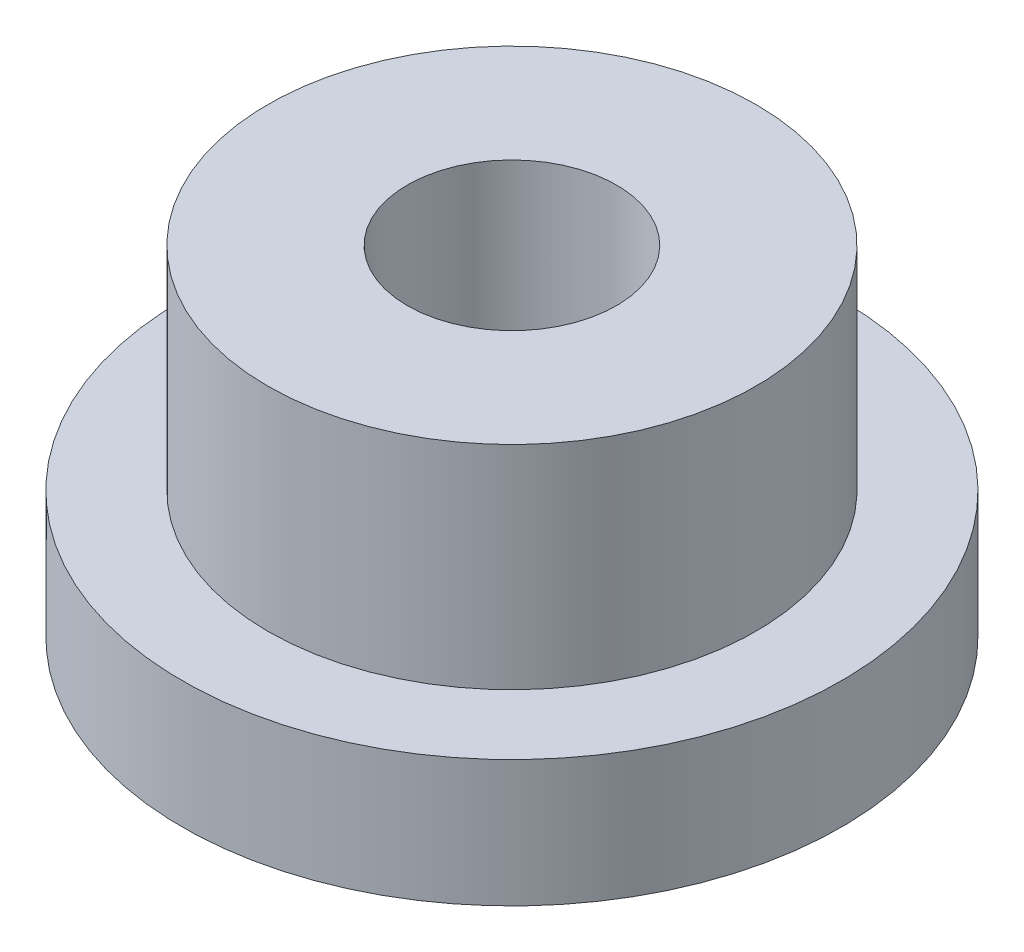
ISO-10303-21;
HEADER;
FILE_DESCRIPTION(('STEP AP214'),'2;1');
FILE_NAME('part.step','',(''),(''),'','','');
FILE_SCHEMA(('AUTOMOTIVE_DESIGN { 1 0 10303 214 1 1 1 1 }'));
ENDSEC;
DATA;
#1=APPLICATION_CONTEXT('core data for automotive mechanical design processes');
#2=APPLICATION_PROTOCOL_DEFINITION('international standard','automotive_design',2000,#1);
#3=PRODUCT_CONTEXT('',#1,'mechanical');
#4=PRODUCT('Part','Part','',(#3));
#5=PRODUCT_RELATED_PRODUCT_CATEGORY('part','',(#4));
#6=PRODUCT_DEFINITION_FORMATION('','',#4);
#7=PRODUCT_DEFINITION_CONTEXT('part definition',#1,'design');
#8=PRODUCT_DEFINITION('design','',#6,#7);
#9=PRODUCT_DEFINITION_SHAPE('','',#8);
#10=(LENGTH_UNIT() NAMED_UNIT(*) SI_UNIT(.MILLI.,.METRE.));
#11=(NAMED_UNIT(*) PLANE_ANGLE_UNIT() SI_UNIT($,.RADIAN.));
#12=(NAMED_UNIT(*) SI_UNIT($,.STERADIAN.) SOLID_ANGLE_UNIT());
#13=UNCERTAINTY_MEASURE_WITH_UNIT(LENGTH_MEASURE(1.E-05),#10,'distance_accuracy_value','');
#14=(GEOMETRIC_REPRESENTATION_CONTEXT(3) GLOBAL_UNCERTAINTY_ASSIGNED_CONTEXT((#13)) GLOBAL_UNIT_ASSIGNED_CONTEXT((#10,
#11,#12)) REPRESENTATION_CONTEXT('',''));
#15=CARTESIAN_POINT('',(0.,0.,0.));
#16=DIRECTION('',(0.,0.,1.));
#17=DIRECTION('',(1.,0.,0.));
#18=AXIS2_PLACEMENT_3D('',#15,#16,#17);
#19=CARTESIAN_POINT('',(0.,-3.35,0.));
#20=DIRECTION('',(0.,1.,0.));
#21=DIRECTION('',(0.,0.,1.));
#22=AXIS2_PLACEMENT_3D('',#19,#20,#21);
#23=CYLINDRICAL_SURFACE('',#22,3.85);
#24=CARTESIAN_POINT('',(0.,-3.35,0.));
#25=DIRECTION('',(0.,1.,0.));
#26=DIRECTION('',(0.,0.,1.));
#27=AXIS2_PLACEMENT_3D('',#24,#25,#26);
#28=CIRCLE('',#27,3.85);
#29=CARTESIAN_POINT('',(0.,-3.35,3.85));
#30=VERTEX_POINT('',#29);
#31=EDGE_CURVE('E56',#30,#30,#28,.T.);
#32=ORIENTED_EDGE('',*,*,#31,.T.);
#33=EDGE_LOOP('',(#32));
#34=FACE_BOUND('',#33,.T.);
#35=CARTESIAN_POINT('',(0.,0.,0.));
#36=DIRECTION('',(0.,1.,0.));
#37=DIRECTION('',(0.,0.,1.));
#38=AXIS2_PLACEMENT_3D('',#35,#36,#37);
#39=CIRCLE('',#38,3.85);
#40=CARTESIAN_POINT('',(0.,0.,3.85));
#41=VERTEX_POINT('',#40);
#42=EDGE_CURVE('E11',#41,#41,#39,.T.);
#43=ORIENTED_EDGE('',*,*,#42,.F.);
#44=EDGE_LOOP('',(#43));
#45=FACE_BOUND('',#44,.T.);
#46=ADVANCED_FACE('F43',(#34,#45),#23,.T.);
#47=CARTESIAN_POINT('',(0.,0.,0.));
#48=DIRECTION('',(0.,1.,0.));
#49=DIRECTION('',(0.,0.,1.));
#50=AXIS2_PLACEMENT_3D('',#47,#48,#49);
#51=PLANE('',#50);
#52=CARTESIAN_POINT('',(0.,0.,0.));
#53=DIRECTION('',(0.,1.,0.));
#54=DIRECTION('',(0.,0.,1.));
#55=AXIS2_PLACEMENT_3D('',#52,#53,#54);
#56=CIRCLE('',#55,1.65);
#57=CARTESIAN_POINT('',(0.,0.,1.65));
#58=VERTEX_POINT('',#57);
#59=EDGE_CURVE('E51',#58,#58,#56,.T.);
#60=ORIENTED_EDGE('',*,*,#59,.F.);
#61=EDGE_LOOP('',(#60));
#62=FACE_BOUND('',#61,.T.);
#63=ORIENTED_EDGE('',*,*,#42,.T.);
#64=EDGE_LOOP('',(#63));
#65=FACE_BOUND('',#64,.T.);
#66=ADVANCED_FACE('F95',(#62,#65),#51,.T.);
#67=CARTESIAN_POINT('',(0.,-3.35,0.));
#68=DIRECTION('',(0.,1.,0.));
#69=DIRECTION('',(0.,0.,1.));
#70=AXIS2_PLACEMENT_3D('',#67,#68,#69);
#71=CYLINDRICAL_SURFACE('',#70,1.65);
#72=CARTESIAN_POINT('',(0.,-3.35,0.));
#73=DIRECTION('',(0.,-1.,0.));
#74=DIRECTION('',(0.,0.,-1.));
#75=AXIS2_PLACEMENT_3D('',#72,#73,#74);
#76=CIRCLE('',#75,1.65);
#77=CARTESIAN_POINT('',(-0.535444465351778,-3.35,-1.56070472047859));
#78=VERTEX_POINT('',#77);
#79=EDGE_CURVE('E46',#78,#78,#76,.T.);
#80=ORIENTED_EDGE('',*,*,#79,.T.);
#81=EDGE_LOOP('',(#80));
#82=FACE_BOUND('',#81,.T.);
#83=ORIENTED_EDGE('',*,*,#59,.T.);
#84=EDGE_LOOP('',(#83));
#85=FACE_BOUND('',#84,.T.);
#86=ADVANCED_FACE('F88',(#82,#85),#71,.F.);
#87=CARTESIAN_POINT('',(0.,-3.35,0.));
#88=DIRECTION('',(0.,-1.,0.));
#89=DIRECTION('',(0.,0.,-1.));
#90=AXIS2_PLACEMENT_3D('',#87,#88,#89);
#91=PLANE('',#90);
#92=ORIENTED_EDGE('',*,*,#31,.F.);
#93=EDGE_LOOP('',(#92));
#94=FACE_BOUND('',#93,.T.);
#95=CARTESIAN_POINT('',(0.,-3.35,0.));
#96=DIRECTION('',(0.,-1.,0.));
#97=DIRECTION('',(0.,0.,-1.));
#98=AXIS2_PLACEMENT_3D('',#95,#96,#97);
#99=CIRCLE('',#98,5.2);
#100=CARTESIAN_POINT('',(0.,-3.35,-5.2));
#101=VERTEX_POINT('',#100);
#102=EDGE_CURVE('E119',#101,#101,#99,.T.);
#103=ORIENTED_EDGE('',*,*,#102,.F.);
#104=EDGE_LOOP('',(#103));
#105=FACE_BOUND('',#104,.T.);
#106=ADVANCED_FACE('F81',(#94,#105),#91,.F.);
#107=CARTESIAN_POINT('',(0.,-5.35,0.));
#108=DIRECTION('',(0.,-1.,0.));
#109=DIRECTION('',(0.,0.,-1.));
#110=AXIS2_PLACEMENT_3D('',#107,#108,#109);
#111=PLANE('',#110);
#112=CARTESIAN_POINT('',(0.,-5.35,0.));
#113=DIRECTION('',(0.,-1.,0.));
#114=DIRECTION('',(0.,0.,-1.));
#115=AXIS2_PLACEMENT_3D('',#112,#113,#114);
#116=CIRCLE('',#115,3.65);
#117=CARTESIAN_POINT('',(0.764858595896589,-5.35,-3.56896222006946));
#118=VERTEX_POINT('',#117);
#119=EDGE_CURVE('E64',#118,#118,#116,.T.);
#120=ORIENTED_EDGE('',*,*,#119,.F.);
#121=EDGE_LOOP('',(#120));
#122=FACE_BOUND('',#121,.T.);
#123=CARTESIAN_POINT('',(0.,-5.35,0.));
#124=DIRECTION('',(0.,-1.,0.));
#125=DIRECTION('',(0.,0.,-1.));
#126=AXIS2_PLACEMENT_3D('',#123,#124,#125);
#127=CIRCLE('',#126,5.2);
#128=CARTESIAN_POINT('',(0.,-5.35,-5.2));
#129=VERTEX_POINT('',#128);
#130=EDGE_CURVE('E117',#129,#129,#127,.T.);
#131=ORIENTED_EDGE('',*,*,#130,.T.);
#132=EDGE_LOOP('',(#131));
#133=FACE_BOUND('',#132,.T.);
#134=ADVANCED_FACE('F70',(#122,#133),#111,.T.);
#135=CARTESIAN_POINT('',(0.,-5.35,0.));
#136=DIRECTION('',(0.,1.,0.));
#137=DIRECTION('',(0.,0.,1.));
#138=AXIS2_PLACEMENT_3D('',#135,#136,#137);
#139=CYLINDRICAL_SURFACE('',#138,5.2);
#140=ORIENTED_EDGE('',*,*,#130,.F.);
#141=EDGE_LOOP('',(#140));
#142=FACE_BOUND('',#141,.T.);
#143=ORIENTED_EDGE('',*,*,#102,.T.);
#144=EDGE_LOOP('',(#143));
#145=FACE_BOUND('',#144,.T.);
#146=ADVANCED_FACE('F80',(#142,#145),#139,.T.);
#147=CARTESIAN_POINT('',(0.764858595896589,-5.35,-3.56896222006946));
#148=CARTESIAN_POINT('',(-0.535444465351778,-3.35,-1.56070472047859));
#149=CARTESIAN_POINT('',(-6.37306584424233,-5.35,-5.09867941186264));
#150=CARTESIAN_POINT('',(-3.65685390630895,-3.35,-0.489815789775032));
#151=CARTESIAN_POINT('',(-7.90278303603551,-5.35,2.03924502827628));
#152=CARTESIAN_POINT('',(-2.5859649756054,-3.35,2.63159365118214));
#153=CARTESIAN_POINT('',(-0.764858595896587,-5.35,3.56896222006946));
#154=CARTESIAN_POINT('',(0.535444465351778,-3.35,1.56070472047859));
#155=CARTESIAN_POINT('',(6.37306584424233,-5.35,5.09867941186263));
#156=CARTESIAN_POINT('',(3.65685390630895,-3.35,0.489815789775033));
#157=CARTESIAN_POINT('',(7.9027830360355,-5.35,-2.03924502827628));
#158=CARTESIAN_POINT('',(2.5859649756054,-3.35,-2.63159365118214));
#159=CARTESIAN_POINT('',(0.764858595896589,-5.35,-3.56896222006946));
#160=CARTESIAN_POINT('',(-0.535444465351778,-3.35,-1.56070472047859));
#161=(BOUNDED_SURFACE() B_SPLINE_SURFACE(3,1,((#147,#148),(#149,#150),(#151,#152),(#153,#154),
(#155,#156),(#157,#158),(#159,#160)),.UNSPECIFIED.,.T.,.F.,.F.) B_SPLINE_SURFACE_WITH_KNOTS((4,
3,4),(2,2),(0.,0.5,1.),(0.,1.),
.UNSPECIFIED.) GEOMETRIC_REPRESENTATION_ITEM() RATIONAL_B_SPLINE_SURFACE(((1.,1.),
(0.333333333333333,0.333333333333333),(0.333333333333333,0.333333333333333),(1.,1.),
(0.333333333333333,0.333333333333333),(0.333333333333333,0.333333333333333),(1.,1.))) REPRESENTATION_ITEM('') SURFACE());
#162=CARTESIAN_POINT('',(0.764858595896589,-5.35,-3.56896222006946));
#163=CARTESIAN_POINT('',(0.751313772341919,-5.32916666666667,-3.54804287111538));
#164=CARTESIAN_POINT('',(0.737768948787249,-5.30833333333333,-3.52712352216131));
#165=CARTESIAN_POINT('',(0.710679301677907,-5.26666666666667,-3.48528482425317));
#166=CARTESIAN_POINT('',(0.697134478123237,-5.24583333333334,-3.4643654752991));
#167=CARTESIAN_POINT('',(0.670044831013896,-5.20416666666667,-3.42252677739096));
#168=CARTESIAN_POINT('',(0.656500007459225,-5.18333333333333,-3.40160742843688));
#169=CARTESIAN_POINT('',(0.629410360349884,-5.14166666666667,-3.35976873052874));
#170=CARTESIAN_POINT('',(0.615865536795214,-5.12083333333333,-3.33884938157467));
#171=CARTESIAN_POINT('',(0.588775889685873,-5.07916666666667,-3.29701068366653));
#172=CARTESIAN_POINT('',(0.575231066131202,-5.05833333333333,-3.27609133471245));
#173=CARTESIAN_POINT('',(0.548141419021861,-5.01666666666667,-3.23425263680431));
#174=CARTESIAN_POINT('',(0.534596595467191,-4.99583333333333,-3.21333328785024));
#175=CARTESIAN_POINT('',(0.50750694835785,-4.95416666666667,-3.1714945899421));
#176=CARTESIAN_POINT('',(0.49396212480318,-4.93333333333333,-3.15057524098803));
#177=CARTESIAN_POINT('',(0.466872477693839,-4.89166666666667,-3.10873654307988));
#178=CARTESIAN_POINT('',(0.453327654139168,-4.87083333333333,-3.08781719412581));
#179=CARTESIAN_POINT('',(0.426238007029827,-4.82916666666667,-3.04597849621767));
#180=CARTESIAN_POINT('',(0.412693183475156,-4.80833333333333,-3.0250591472636));
#181=CARTESIAN_POINT('',(0.385603536365815,-4.76666666666667,-2.98322044935545));
#182=CARTESIAN_POINT('',(0.372058712811145,-4.74583333333333,-2.96230110040138));
#183=CARTESIAN_POINT('',(0.344969065701804,-4.70416666666667,-2.92046240249324));
#184=CARTESIAN_POINT('',(0.331424242147134,-4.68333333333333,-2.89954305353917));
#185=CARTESIAN_POINT('',(0.304334595037793,-4.64166666666667,-2.85770435563102));
#186=CARTESIAN_POINT('',(0.290789771483122,-4.62083333333333,-2.83678500667695));
#187=CARTESIAN_POINT('',(0.263700124373781,-4.57916666666667,-2.79494630876881));
#188=CARTESIAN_POINT('',(0.250155300819111,-4.55833333333333,-2.77402695981474));
#189=CARTESIAN_POINT('',(0.223065653709769,-4.51666666666667,-2.73218826190659));
#190=CARTESIAN_POINT('',(0.209520830155099,-4.49583333333333,-2.71126891295252));
#191=CARTESIAN_POINT('',(0.182431183045758,-4.45416666666667,-2.66943021504438));
#192=CARTESIAN_POINT('',(0.168886359491088,-4.43333333333333,-2.64851086609031));
#193=CARTESIAN_POINT('',(0.141796712381747,-4.39166666666667,-2.60667216818217));
#194=CARTESIAN_POINT('',(0.128251888827076,-4.37083333333333,-2.58575281922809));
#195=CARTESIAN_POINT('',(0.101162241717735,-4.32916666666667,-2.54391412131995));
#196=CARTESIAN_POINT('',(0.0876174181630646,-4.30833333333333,-2.52299477236588));
#197=CARTESIAN_POINT('',(0.0605277710537237,-4.26666666666667,-2.48115607445774));
#198=CARTESIAN_POINT('',(0.0469829474990531,-4.24583333333333,-2.46023672550366));
#199=CARTESIAN_POINT('',(0.0198933003897121,-4.20416666666667,-2.41839802759552));
#200=CARTESIAN_POINT('',(0.00634847683504179,-4.18333333333333,-2.39747867864145));
#201=CARTESIAN_POINT('',(-0.0207411702742992,-4.14166666666667,-2.35563998073331));
#202=CARTESIAN_POINT('',(-0.0342859938289699,-4.12083333333333,-2.33472063177924));
#203=CARTESIAN_POINT('',(-0.0613756409383109,-4.07916666666667,-2.29288193387109));
#204=CARTESIAN_POINT('',(-0.0749204644929813,-4.05833333333333,-2.27196258491702));
#205=CARTESIAN_POINT('',(-0.102010111602322,-4.01666666666667,-2.23012388700888));
#206=CARTESIAN_POINT('',(-0.115554935156993,-3.99583333333333,-2.20920453805481));
#207=CARTESIAN_POINT('',(-0.142644582266334,-3.95416666666667,-2.16736584014666));
#208=CARTESIAN_POINT('',(-0.156189405821004,-3.93333333333333,-2.14644649119259));
#209=CARTESIAN_POINT('',(-0.183279052930345,-3.89166666666667,-2.10460779328445));
#210=CARTESIAN_POINT('',(-0.196823876485016,-3.87083333333333,-2.08368844433038));
#211=CARTESIAN_POINT('',(-0.223913523594357,-3.82916666666667,-2.04184974642223));
#212=CARTESIAN_POINT('',(-0.237458347149027,-3.80833333333333,-2.02093039746816));
#213=CARTESIAN_POINT('',(-0.264547994258368,-3.76666666666667,-1.97909169956002));
#214=CARTESIAN_POINT('',(-0.278092817813039,-3.74583333333333,-1.95817235060595));
#215=CARTESIAN_POINT('',(-0.30518246492238,-3.70416666666667,-1.9163336526978));
#216=CARTESIAN_POINT('',(-0.31872728847705,-3.68333333333333,-1.89541430374373));
#217=CARTESIAN_POINT('',(-0.345816935586391,-3.64166666666667,-1.85357560583559));
#218=CARTESIAN_POINT('',(-0.359361759141062,-3.62083333333333,-1.83265625688152));
#219=CARTESIAN_POINT('',(-0.386451406250403,-3.57916666666667,-1.79081755897338));
#220=CARTESIAN_POINT('',(-0.399996229805073,-3.55833333333333,-1.7698982100193));
#221=CARTESIAN_POINT('',(-0.427085876914414,-3.51666666666667,-1.72805951211116));
#222=CARTESIAN_POINT('',(-0.440630700469085,-3.49583333333333,-1.70714016315709));
#223=CARTESIAN_POINT('',(-0.467720347578426,-3.45416666666667,-1.66530146524895));
#224=CARTESIAN_POINT('',(-0.481265171133096,-3.43333333333333,-1.64438211629487));
#225=CARTESIAN_POINT('',(-0.508354818242437,-3.39166666666667,-1.60254341838673));
#226=CARTESIAN_POINT('',(-0.521899641797107,-3.37083333333333,-1.58162406943266));
#227=CARTESIAN_POINT('',(-0.535444465351778,-3.35,-1.56070472047859));
#228=B_SPLINE_CURVE_WITH_KNOTS('',3,(#162,#163,#164,#165,#166,#167,#168,#169,#170,#171,#172,
#173,#174,#175,#176,#177,#178,#179,#180,#181,#182,#183,#184,#185,#186,#187,#188,#189,#190,#191,
#192,#193,#194,#195,#196,#197,#198,#199,#200,#201,#202,#203,#204,#205,#206,#207,#208,#209,#210,
#211,#212,#213,#214,#215,#216,#217,#218,#219,#220,#221,#222,#223,#224,#225,#226,#227),
.UNSPECIFIED.,.F.,.F.,(4,2,2,2,2,2,2,2,2,2,2,2,2,2,2,2,2,2,2,2,2,2,2,2,2,2,2,2,2,2,2,2,4),(0.,
0.0974473327090298,0.194894665418059,0.292341998127089,0.389789330836119,0.487236663545149,
0.584683996254178,0.682131328963208,0.779578661672238,0.877025994381267,0.974473327090298,
1.07192065979933,1.16936799250836,1.26681532521739,1.36426265792642,1.46170999063545,
1.55915732334448,1.65660465605351,1.75405198876254,1.85149932147157,1.94894665418059,
2.04639398688962,2.14384131959865,2.24128865230768,2.33873598501671,2.43618331772574,
2.53363065043477,2.6310779831438,2.72852531585283,2.82597264856186,2.92341998127089,
3.02086731397992,3.11831464668895),.UNSPECIFIED.);
#229=EDGE_CURVE('BSEAM82',#118,#78,#228,.T.);
#230=ORIENTED_EDGE('',*,*,#119,.T.);
#231=ORIENTED_EDGE('',*,*,#79,.F.);
#232=ORIENTED_EDGE('',*,*,#229,.T.);
#233=ORIENTED_EDGE('',*,*,#229,.F.);
#234=EDGE_LOOP('',(#230,#232,#231,#233));
#235=FACE_BOUND('',#234,.T.);
#236=ADVANCED_FACE('F82',(#235),#161,.F.);
#237=CLOSED_SHELL('',(#46,#66,#86,#106,#134,#146,#236));
#238=MANIFOLD_SOLID_BREP('B2',#237);
#239=ADVANCED_BREP_SHAPE_REPRESENTATION('',(#18,#238),#14);
#240=SHAPE_DEFINITION_REPRESENTATION(#9,#239);
ENDSEC;
END-ISO-10303-21;
